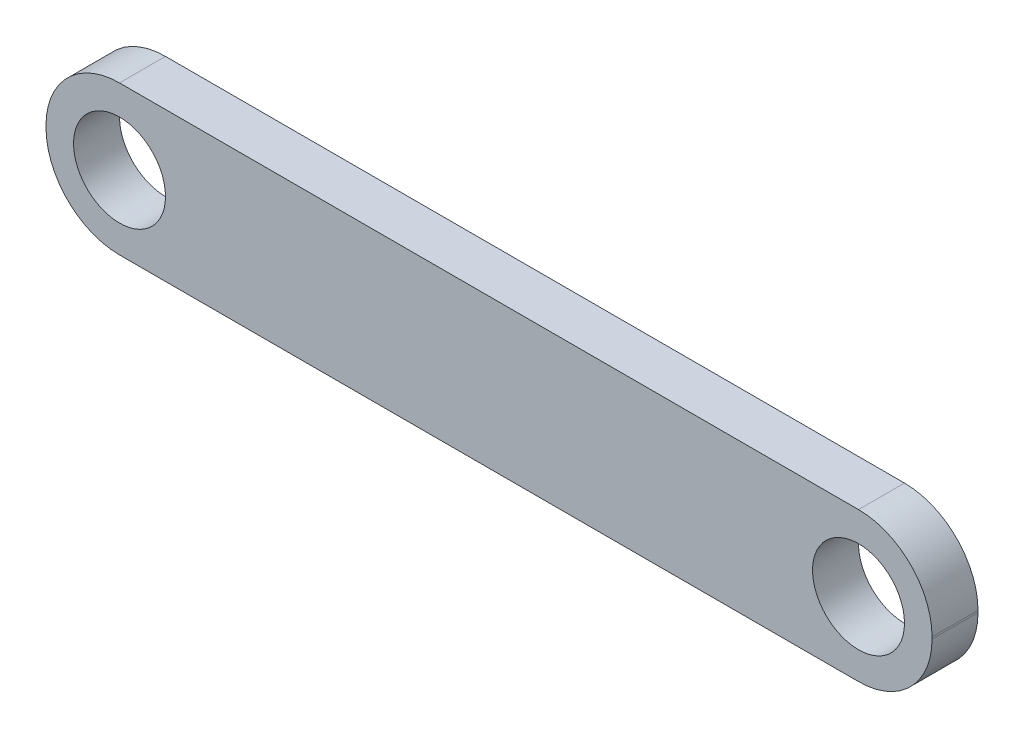
ISO-10303-21;
HEADER;
FILE_DESCRIPTION(('STEP AP214'),'2;1');
FILE_NAME('part.step','',(''),(''),'','','');
FILE_SCHEMA(('AUTOMOTIVE_DESIGN { 1 0 10303 214 1 1 1 1 }'));
ENDSEC;
DATA;
#1=APPLICATION_CONTEXT('core data for automotive mechanical design processes');
#2=APPLICATION_PROTOCOL_DEFINITION('international standard','automotive_design',2000,#1);
#3=PRODUCT_CONTEXT('',#1,'mechanical');
#4=PRODUCT('Part','Part','',(#3));
#5=PRODUCT_RELATED_PRODUCT_CATEGORY('part','',(#4));
#6=PRODUCT_DEFINITION_FORMATION('','',#4);
#7=PRODUCT_DEFINITION_CONTEXT('part definition',#1,'design');
#8=PRODUCT_DEFINITION('design','',#6,#7);
#9=PRODUCT_DEFINITION_SHAPE('','',#8);
#10=(LENGTH_UNIT() NAMED_UNIT(*) SI_UNIT(.MILLI.,.METRE.));
#11=(NAMED_UNIT(*) PLANE_ANGLE_UNIT() SI_UNIT($,.RADIAN.));
#12=(NAMED_UNIT(*) SI_UNIT($,.STERADIAN.) SOLID_ANGLE_UNIT());
#13=UNCERTAINTY_MEASURE_WITH_UNIT(LENGTH_MEASURE(1.E-05),#10,'distance_accuracy_value','');
#14=(GEOMETRIC_REPRESENTATION_CONTEXT(3) GLOBAL_UNCERTAINTY_ASSIGNED_CONTEXT((#13)) GLOBAL_UNIT_ASSIGNED_CONTEXT((#10,
#11,#12)) REPRESENTATION_CONTEXT('',''));
#15=CARTESIAN_POINT('',(0.,0.,0.));
#16=DIRECTION('',(0.,0.,1.));
#17=DIRECTION('',(1.,0.,0.));
#18=AXIS2_PLACEMENT_3D('',#15,#16,#17);
#19=CARTESIAN_POINT('',(-97.7496567254353,-20.6842642939529,10.));
#20=DIRECTION('',(0.,0.,1.));
#21=DIRECTION('',(1.,0.,0.));
#22=AXIS2_PLACEMENT_3D('',#19,#20,#21);
#23=PLANE('',#22);
#24=CARTESIAN_POINT('',(-97.7496567254353,-20.6842642939529,10.));
#25=DIRECTION('',(0.,0.,1.));
#26=DIRECTION('',(1.,0.,0.));
#27=AXIS2_PLACEMENT_3D('',#24,#25,#26);
#28=CIRCLE('',#27,9.99999999999999);
#29=CARTESIAN_POINT('',(-87.7496567254353,-20.6842642939529,10.));
#30=VERTEX_POINT('',#29);
#31=EDGE_CURVE('E146',#30,#30,#28,.T.);
#32=ORIENTED_EDGE('',*,*,#31,.F.);
#33=EDGE_LOOP('',(#32));
#34=FACE_BOUND('',#33,.T.);
#35=CARTESIAN_POINT('',(-97.7496567254353,-20.6842642939529,10.));
#36=DIRECTION('',(0.,0.,1.));
#37=DIRECTION('',(1.,0.,0.));
#38=AXIS2_PLACEMENT_3D('',#35,#36,#37);
#39=CIRCLE('',#38,16.);
#40=CARTESIAN_POINT('',(-113.749656725435,-20.6842642939528,10.));
#41=VERTEX_POINT('',#40);
#42=CARTESIAN_POINT('',(-97.7496567254352,-36.6842642939529,10.));
#43=VERTEX_POINT('',#42);
#44=EDGE_CURVE('E164',#41,#43,#39,.T.);
#45=ORIENTED_EDGE('',*,*,#44,.T.);
#46=DIRECTION('',(1.,0.,0.));
#47=VECTOR('',#46,1.);
#48=CARTESIAN_POINT('',(-97.7496567254352,-36.6842642939529,10.));
#49=LINE('',#48,#47);
#50=CARTESIAN_POINT('',(63.0560114241774,-36.6842642939529,10.));
#51=VERTEX_POINT('',#50);
#52=EDGE_CURVE('E100',#43,#51,#49,.T.);
#53=ORIENTED_EDGE('',*,*,#52,.T.);
#54=CARTESIAN_POINT('',(63.0560114241775,-20.6842642939529,10.));
#55=DIRECTION('',(0.,0.,1.));
#56=DIRECTION('',(1.,0.,0.));
#57=AXIS2_PLACEMENT_3D('',#54,#55,#56);
#58=CIRCLE('',#57,16.);
#59=CARTESIAN_POINT('',(79.0560114241775,-20.6842642939528,10.));
#60=VERTEX_POINT('',#59);
#61=EDGE_CURVE('E185',#51,#60,#58,.T.);
#62=ORIENTED_EDGE('',*,*,#61,.T.);
#63=DIRECTION('',(0.,1.,0.));
#64=VECTOR('',#63,1.);
#65=CARTESIAN_POINT('',(79.0560114241775,-20.265612127204,10.));
#66=LINE('',#65,#64);
#67=CARTESIAN_POINT('',(79.0560114241775,-20.265612127204,10.));
#68=VERTEX_POINT('',#67);
#69=EDGE_CURVE('E199',#60,#68,#66,.T.);
#70=ORIENTED_EDGE('',*,*,#69,.T.);
#71=CARTESIAN_POINT('',(63.0560114241775,-20.2656121272038,10.));
#72=DIRECTION('',(0.,0.,1.));
#73=DIRECTION('',(-1.,0.,0.));
#74=AXIS2_PLACEMENT_3D('',#71,#72,#73);
#75=CIRCLE('',#74,16.);
#76=CARTESIAN_POINT('',(63.0560114241774,-4.26561212720383,10.));
#77=VERTEX_POINT('',#76);
#78=EDGE_CURVE('E119',#68,#77,#75,.T.);
#79=ORIENTED_EDGE('',*,*,#78,.T.);
#80=DIRECTION('',(-1.,0.,0.));
#81=VECTOR('',#80,1.);
#82=CARTESIAN_POINT('',(-97.7496567254352,-4.26561212720383,10.));
#83=LINE('',#82,#81);
#84=CARTESIAN_POINT('',(-97.7496567254352,-4.26561212720383,10.));
#85=VERTEX_POINT('',#84);
#86=EDGE_CURVE('E113',#77,#85,#83,.T.);
#87=ORIENTED_EDGE('',*,*,#86,.T.);
#88=CARTESIAN_POINT('',(-97.7496567254353,-20.2656121272038,10.));
#89=DIRECTION('',(0.,0.,1.));
#90=DIRECTION('',(1.,0.,0.));
#91=AXIS2_PLACEMENT_3D('',#88,#89,#90);
#92=CIRCLE('',#91,16.);
#93=CARTESIAN_POINT('',(-113.749656725435,-20.2656121272039,10.));
#94=VERTEX_POINT('',#93);
#95=EDGE_CURVE('E117',#85,#94,#92,.T.);
#96=ORIENTED_EDGE('',*,*,#95,.T.);
#97=DIRECTION('',(0.,-1.,0.));
#98=VECTOR('',#97,1.);
#99=CARTESIAN_POINT('',(-113.749656725435,-20.2656121272039,10.));
#100=LINE('',#99,#98);
#101=EDGE_CURVE('E57',#94,#41,#100,.T.);
#102=ORIENTED_EDGE('',*,*,#101,.T.);
#103=EDGE_LOOP('',(#45,#53,#62,#70,#79,#87,#96,#102));
#104=FACE_BOUND('',#103,.T.);
#105=CARTESIAN_POINT('',(63.0560114241775,-20.6842642939529,10.));
#106=DIRECTION('',(0.,0.,1.));
#107=DIRECTION('',(1.,0.,0.));
#108=AXIS2_PLACEMENT_3D('',#105,#106,#107);
#109=CIRCLE('',#108,9.99999999999999);
#110=CARTESIAN_POINT('',(73.0560114241775,-20.6842642939529,10.));
#111=VERTEX_POINT('',#110);
#112=EDGE_CURVE('E213',#111,#111,#109,.T.);
#113=ORIENTED_EDGE('',*,*,#112,.F.);
#114=EDGE_LOOP('',(#113));
#115=FACE_BOUND('',#114,.T.);
#116=ADVANCED_FACE('F39',(#34,#104,#115),#23,.T.);
#117=CARTESIAN_POINT('',(-97.7496567254353,-20.6842642939529,0.));
#118=DIRECTION('',(0.,0.,1.));
#119=DIRECTION('',(1.,0.,0.));
#120=AXIS2_PLACEMENT_3D('',#117,#118,#119);
#121=PLANE('',#120);
#122=CARTESIAN_POINT('',(-97.7496567254353,-20.6842642939529,0.));
#123=DIRECTION('',(0.,0.,1.));
#124=DIRECTION('',(1.,0.,0.));
#125=AXIS2_PLACEMENT_3D('',#122,#123,#124);
#126=CIRCLE('',#125,16.);
#127=CARTESIAN_POINT('',(-113.749656725435,-20.6842642939528,0.));
#128=VERTEX_POINT('',#127);
#129=CARTESIAN_POINT('',(-97.7496567254352,-36.6842642939529,0.));
#130=VERTEX_POINT('',#129);
#131=EDGE_CURVE('E141',#128,#130,#126,.T.);
#132=ORIENTED_EDGE('',*,*,#131,.F.);
#133=DIRECTION('',(0.,-1.,0.));
#134=VECTOR('',#133,1.);
#135=CARTESIAN_POINT('',(-113.749656725435,-20.2656121272039,0.));
#136=LINE('',#135,#134);
#137=CARTESIAN_POINT('',(-113.749656725435,-20.2656121272039,0.));
#138=VERTEX_POINT('',#137);
#139=EDGE_CURVE('E92',#138,#128,#136,.T.);
#140=ORIENTED_EDGE('',*,*,#139,.F.);
#141=CARTESIAN_POINT('',(-97.7496567254353,-20.2656121272038,0.));
#142=DIRECTION('',(0.,0.,1.));
#143=DIRECTION('',(1.,0.,0.));
#144=AXIS2_PLACEMENT_3D('',#141,#142,#143);
#145=CIRCLE('',#144,16.);
#146=CARTESIAN_POINT('',(-97.7496567254352,-4.26561212720383,0.));
#147=VERTEX_POINT('',#146);
#148=EDGE_CURVE('E86',#147,#138,#145,.T.);
#149=ORIENTED_EDGE('',*,*,#148,.F.);
#150=DIRECTION('',(-1.,0.,0.));
#151=VECTOR('',#150,1.);
#152=CARTESIAN_POINT('',(-97.7496567254352,-4.26561212720383,0.));
#153=LINE('',#152,#151);
#154=CARTESIAN_POINT('',(63.0560114241774,-4.26561212720383,0.));
#155=VERTEX_POINT('',#154);
#156=EDGE_CURVE('E128',#155,#147,#153,.T.);
#157=ORIENTED_EDGE('',*,*,#156,.F.);
#158=CARTESIAN_POINT('',(63.0560114241775,-20.2656121272038,0.));
#159=DIRECTION('',(0.,0.,1.));
#160=DIRECTION('',(-1.,0.,0.));
#161=AXIS2_PLACEMENT_3D('',#158,#159,#160);
#162=CIRCLE('',#161,16.);
#163=CARTESIAN_POINT('',(79.0560114241775,-20.265612127204,0.));
#164=VERTEX_POINT('',#163);
#165=EDGE_CURVE('E155',#164,#155,#162,.T.);
#166=ORIENTED_EDGE('',*,*,#165,.F.);
#167=DIRECTION('',(0.,1.,0.));
#168=VECTOR('',#167,1.);
#169=CARTESIAN_POINT('',(79.0560114241775,-20.265612127204,0.));
#170=LINE('',#169,#168);
#171=CARTESIAN_POINT('',(79.0560114241775,-20.6842642939528,0.));
#172=VERTEX_POINT('',#171);
#173=EDGE_CURVE('E152',#172,#164,#170,.T.);
#174=ORIENTED_EDGE('',*,*,#173,.F.);
#175=CARTESIAN_POINT('',(63.0560114241775,-20.6842642939529,0.));
#176=DIRECTION('',(0.,0.,1.));
#177=DIRECTION('',(1.,0.,0.));
#178=AXIS2_PLACEMENT_3D('',#175,#176,#177);
#179=CIRCLE('',#178,16.);
#180=CARTESIAN_POINT('',(63.0560114241774,-36.6842642939529,0.));
#181=VERTEX_POINT('',#180);
#182=EDGE_CURVE('E149',#181,#172,#179,.T.);
#183=ORIENTED_EDGE('',*,*,#182,.F.);
#184=DIRECTION('',(1.,0.,0.));
#185=VECTOR('',#184,1.);
#186=CARTESIAN_POINT('',(-97.7496567254352,-36.6842642939529,0.));
#187=LINE('',#186,#185);
#188=EDGE_CURVE('E145',#130,#181,#187,.T.);
#189=ORIENTED_EDGE('',*,*,#188,.F.);
#190=EDGE_LOOP('',(#132,#140,#149,#157,#166,#174,#183,#189));
#191=FACE_BOUND('',#190,.T.);
#192=CARTESIAN_POINT('',(-97.7496567254353,-20.6842642939529,0.));
#193=DIRECTION('',(0.,0.,1.));
#194=DIRECTION('',(1.,0.,0.));
#195=AXIS2_PLACEMENT_3D('',#192,#193,#194);
#196=CIRCLE('',#195,9.99999999999999);
#197=CARTESIAN_POINT('',(-87.7496567254353,-20.6842642939529,0.));
#198=VERTEX_POINT('',#197);
#199=EDGE_CURVE('E209',#198,#198,#196,.T.);
#200=ORIENTED_EDGE('',*,*,#199,.T.);
#201=EDGE_LOOP('',(#200));
#202=FACE_BOUND('',#201,.T.);
#203=CARTESIAN_POINT('',(63.0560114241775,-20.6842642939529,0.));
#204=DIRECTION('',(0.,0.,1.));
#205=DIRECTION('',(1.,0.,0.));
#206=AXIS2_PLACEMENT_3D('',#203,#204,#205);
#207=CIRCLE('',#206,9.99999999999999);
#208=CARTESIAN_POINT('',(73.0560114241775,-20.6842642939529,0.));
#209=VERTEX_POINT('',#208);
#210=EDGE_CURVE('E217',#209,#209,#207,.T.);
#211=ORIENTED_EDGE('',*,*,#210,.T.);
#212=EDGE_LOOP('',(#211));
#213=FACE_BOUND('',#212,.T.);
#214=ADVANCED_FACE('F189',(#191,#202,#213),#121,.F.);
#215=CARTESIAN_POINT('',(-97.7496567254353,-20.6842642939529,10.));
#216=DIRECTION('',(0.,0.,-1.));
#217=DIRECTION('',(-1.,0.,0.));
#218=AXIS2_PLACEMENT_3D('',#215,#216,#217);
#219=CYLINDRICAL_SURFACE('',#218,16.);
#220=ORIENTED_EDGE('',*,*,#131,.T.);
#221=DIRECTION('',(0.,0.,-1.));
#222=VECTOR('',#221,1.);
#223=CARTESIAN_POINT('',(-97.7496567254352,-36.6842642939529,10.));
#224=LINE('',#223,#222);
#225=EDGE_CURVE('E11',#43,#130,#224,.T.);
#226=ORIENTED_EDGE('',*,*,#225,.F.);
#227=ORIENTED_EDGE('',*,*,#44,.F.);
#228=DIRECTION('',(0.,0.,-1.));
#229=VECTOR('',#228,1.);
#230=CARTESIAN_POINT('',(-113.749656725435,-20.6842642939528,10.));
#231=LINE('',#230,#229);
#232=EDGE_CURVE('E137',#41,#128,#231,.T.);
#233=ORIENTED_EDGE('',*,*,#232,.T.);
#234=EDGE_LOOP('',(#220,#226,#227,#233));
#235=FACE_BOUND('',#234,.T.);
#236=ADVANCED_FACE('F41',(#235),#219,.T.);
#237=CARTESIAN_POINT('',(-97.7496567254352,-36.6842642939529,10.));
#238=DIRECTION('',(0.,1.,0.));
#239=DIRECTION('',(0.,0.,1.));
#240=AXIS2_PLACEMENT_3D('',#237,#238,#239);
#241=PLANE('',#240);
#242=ORIENTED_EDGE('',*,*,#188,.T.);
#243=DIRECTION('',(0.,0.,-1.));
#244=VECTOR('',#243,1.);
#245=CARTESIAN_POINT('',(63.0560114241774,-36.6842642939529,10.));
#246=LINE('',#245,#244);
#247=EDGE_CURVE('E49',#51,#181,#246,.T.);
#248=ORIENTED_EDGE('',*,*,#247,.F.);
#249=ORIENTED_EDGE('',*,*,#52,.F.);
#250=ORIENTED_EDGE('',*,*,#225,.T.);
#251=EDGE_LOOP('',(#242,#248,#249,#250));
#252=FACE_BOUND('',#251,.T.);
#253=ADVANCED_FACE('F251',(#252),#241,.F.);
#254=CARTESIAN_POINT('',(63.0560114241775,-20.6842642939529,10.));
#255=DIRECTION('',(0.,0.,-1.));
#256=DIRECTION('',(-1.,0.,0.));
#257=AXIS2_PLACEMENT_3D('',#254,#255,#256);
#258=CYLINDRICAL_SURFACE('',#257,16.);
#259=ORIENTED_EDGE('',*,*,#182,.T.);
#260=DIRECTION('',(0.,0.,-1.));
#261=VECTOR('',#260,1.);
#262=CARTESIAN_POINT('',(79.0560114241775,-20.6842642939528,10.));
#263=LINE('',#262,#261);
#264=EDGE_CURVE('E175',#60,#172,#263,.T.);
#265=ORIENTED_EDGE('',*,*,#264,.F.);
#266=ORIENTED_EDGE('',*,*,#61,.F.);
#267=ORIENTED_EDGE('',*,*,#247,.T.);
#268=EDGE_LOOP('',(#259,#265,#266,#267));
#269=FACE_BOUND('',#268,.T.);
#270=ADVANCED_FACE('F183',(#269),#258,.T.);
#271=CARTESIAN_POINT('',(79.0560114241775,-20.265612127204,10.));
#272=DIRECTION('',(-1.,0.,0.));
#273=DIRECTION('',(0.,0.,1.));
#274=AXIS2_PLACEMENT_3D('',#271,#272,#273);
#275=PLANE('',#274);
#276=ORIENTED_EDGE('',*,*,#173,.T.);
#277=DIRECTION('',(0.,0.,-1.));
#278=VECTOR('',#277,1.);
#279=CARTESIAN_POINT('',(79.0560114241775,-20.265612127204,10.));
#280=LINE('',#279,#278);
#281=EDGE_CURVE('E171',#68,#164,#280,.T.);
#282=ORIENTED_EDGE('',*,*,#281,.F.);
#283=ORIENTED_EDGE('',*,*,#69,.F.);
#284=ORIENTED_EDGE('',*,*,#264,.T.);
#285=EDGE_LOOP('',(#276,#282,#283,#284));
#286=FACE_BOUND('',#285,.T.);
#287=ADVANCED_FACE('F194',(#286),#275,.F.);
#288=CARTESIAN_POINT('',(63.0560114241775,-20.2656121272038,10.));
#289=DIRECTION('',(0.,0.,-1.));
#290=DIRECTION('',(-1.,0.,0.));
#291=AXIS2_PLACEMENT_3D('',#288,#289,#290);
#292=CYLINDRICAL_SURFACE('',#291,16.);
#293=ORIENTED_EDGE('',*,*,#165,.T.);
#294=DIRECTION('',(0.,0.,-1.));
#295=VECTOR('',#294,1.);
#296=CARTESIAN_POINT('',(63.0560114241774,-4.26561212720383,10.));
#297=LINE('',#296,#295);
#298=EDGE_CURVE('E130',#77,#155,#297,.T.);
#299=ORIENTED_EDGE('',*,*,#298,.F.);
#300=ORIENTED_EDGE('',*,*,#78,.F.);
#301=ORIENTED_EDGE('',*,*,#281,.T.);
#302=EDGE_LOOP('',(#293,#299,#300,#301));
#303=FACE_BOUND('',#302,.T.);
#304=ADVANCED_FACE('F197',(#303),#292,.T.);
#305=CARTESIAN_POINT('',(-97.7496567254352,-4.26561212720383,10.));
#306=DIRECTION('',(0.,-1.,0.));
#307=DIRECTION('',(0.,0.,-1.));
#308=AXIS2_PLACEMENT_3D('',#305,#306,#307);
#309=PLANE('',#308);
#310=ORIENTED_EDGE('',*,*,#156,.T.);
#311=DIRECTION('',(0.,0.,-1.));
#312=VECTOR('',#311,1.);
#313=CARTESIAN_POINT('',(-97.7496567254352,-4.26561212720383,10.));
#314=LINE('',#313,#312);
#315=EDGE_CURVE('E125',#85,#147,#314,.T.);
#316=ORIENTED_EDGE('',*,*,#315,.F.);
#317=ORIENTED_EDGE('',*,*,#86,.F.);
#318=ORIENTED_EDGE('',*,*,#298,.T.);
#319=EDGE_LOOP('',(#310,#316,#317,#318));
#320=FACE_BOUND('',#319,.T.);
#321=ADVANCED_FACE('F126',(#320),#309,.F.);
#322=CARTESIAN_POINT('',(-97.7496567254353,-20.2656121272038,10.));
#323=DIRECTION('',(0.,0.,-1.));
#324=DIRECTION('',(-1.,0.,0.));
#325=AXIS2_PLACEMENT_3D('',#322,#323,#324);
#326=CYLINDRICAL_SURFACE('',#325,16.);
#327=ORIENTED_EDGE('',*,*,#148,.T.);
#328=DIRECTION('',(0.,0.,-1.));
#329=VECTOR('',#328,1.);
#330=CARTESIAN_POINT('',(-113.749656725435,-20.2656121272039,10.));
#331=LINE('',#330,#329);
#332=EDGE_CURVE('E131',#94,#138,#331,.T.);
#333=ORIENTED_EDGE('',*,*,#332,.F.);
#334=ORIENTED_EDGE('',*,*,#95,.F.);
#335=ORIENTED_EDGE('',*,*,#315,.T.);
#336=EDGE_LOOP('',(#327,#333,#334,#335));
#337=FACE_BOUND('',#336,.T.);
#338=ADVANCED_FACE('F133',(#337),#326,.T.);
#339=CARTESIAN_POINT('',(-113.749656725435,-20.2656121272039,10.));
#340=DIRECTION('',(1.,0.,0.));
#341=DIRECTION('',(0.,0.,-1.));
#342=AXIS2_PLACEMENT_3D('',#339,#340,#341);
#343=PLANE('',#342);
#344=ORIENTED_EDGE('',*,*,#139,.T.);
#345=ORIENTED_EDGE('',*,*,#232,.F.);
#346=ORIENTED_EDGE('',*,*,#101,.F.);
#347=ORIENTED_EDGE('',*,*,#332,.T.);
#348=EDGE_LOOP('',(#344,#345,#346,#347));
#349=FACE_BOUND('',#348,.T.);
#350=ADVANCED_FACE('F239',(#349),#343,.F.);
#351=CARTESIAN_POINT('',(-97.7496567254353,-20.6842642939529,10.));
#352=DIRECTION('',(0.,0.,-1.));
#353=DIRECTION('',(-1.,0.,0.));
#354=AXIS2_PLACEMENT_3D('',#351,#352,#353);
#355=CYLINDRICAL_SURFACE('',#354,9.99999999999999);
#356=ORIENTED_EDGE('',*,*,#31,.T.);
#357=EDGE_LOOP('',(#356));
#358=FACE_BOUND('',#357,.T.);
#359=ORIENTED_EDGE('',*,*,#199,.F.);
#360=EDGE_LOOP('',(#359));
#361=FACE_BOUND('',#360,.T.);
#362=ADVANCED_FACE('F236',(#358,#361),#355,.F.);
#363=CARTESIAN_POINT('',(63.0560114241775,-20.6842642939529,10.));
#364=DIRECTION('',(0.,0.,-1.));
#365=DIRECTION('',(-1.,0.,0.));
#366=AXIS2_PLACEMENT_3D('',#363,#364,#365);
#367=CYLINDRICAL_SURFACE('',#366,9.99999999999999);
#368=ORIENTED_EDGE('',*,*,#112,.T.);
#369=EDGE_LOOP('',(#368));
#370=FACE_BOUND('',#369,.T.);
#371=ORIENTED_EDGE('',*,*,#210,.F.);
#372=EDGE_LOOP('',(#371));
#373=FACE_BOUND('',#372,.T.);
#374=ADVANCED_FACE('F225',(#370,#373),#367,.F.);
#375=CLOSED_SHELL('',(#116,#214,#236,#253,#270,#287,#304,#321,#338,#350,#362,#374));
#376=MANIFOLD_SOLID_BREP('B2',#375);
#377=ADVANCED_BREP_SHAPE_REPRESENTATION('',(#18,#376),#14);
#378=SHAPE_DEFINITION_REPRESENTATION(#9,#377);
ENDSEC;
END-ISO-10303-21;
